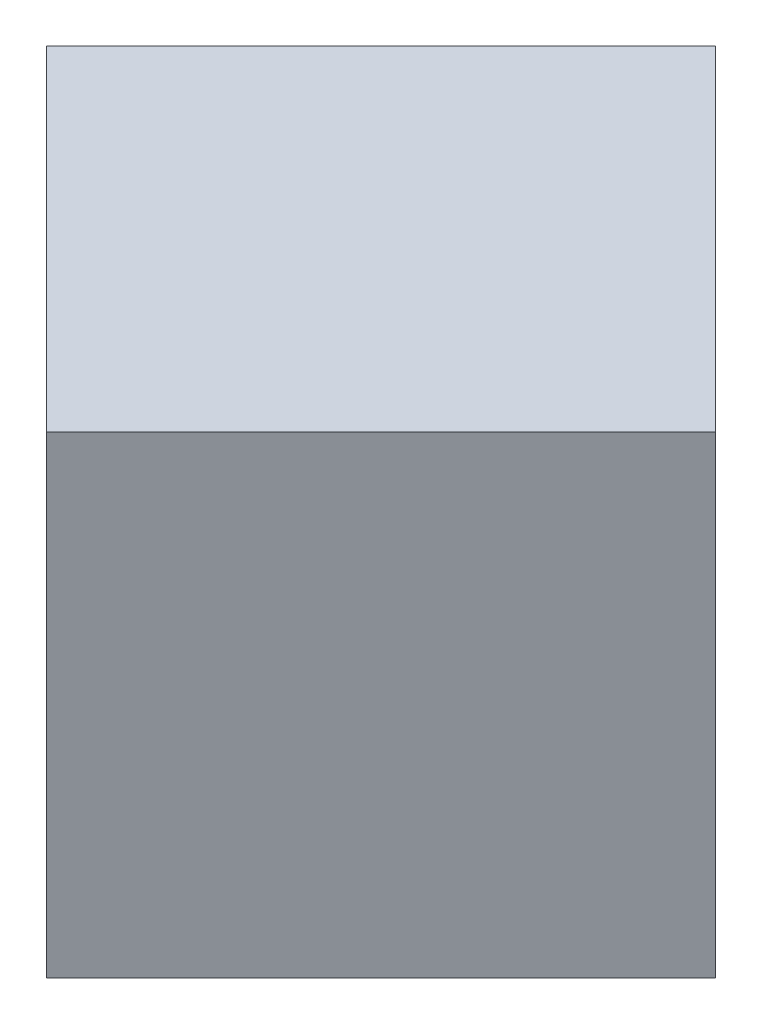
ISO-10303-21;
HEADER;
FILE_DESCRIPTION(('STEP AP214'),'2;1');
FILE_NAME('part.step','',(''),(''),'','','');
FILE_SCHEMA(('AUTOMOTIVE_DESIGN { 1 0 10303 214 1 1 1 1 }'));
ENDSEC;
DATA;
#1=APPLICATION_CONTEXT('core data for automotive mechanical design processes');
#2=APPLICATION_PROTOCOL_DEFINITION('international standard','automotive_design',2000,#1);
#3=PRODUCT_CONTEXT('',#1,'mechanical');
#4=PRODUCT('Part','Part','',(#3));
#5=PRODUCT_RELATED_PRODUCT_CATEGORY('part','',(#4));
#6=PRODUCT_DEFINITION_FORMATION('','',#4);
#7=PRODUCT_DEFINITION_CONTEXT('part definition',#1,'design');
#8=PRODUCT_DEFINITION('design','',#6,#7);
#9=PRODUCT_DEFINITION_SHAPE('','',#8);
#10=(LENGTH_UNIT() NAMED_UNIT(*) SI_UNIT(.MILLI.,.METRE.));
#11=(NAMED_UNIT(*) PLANE_ANGLE_UNIT() SI_UNIT($,.RADIAN.));
#12=(NAMED_UNIT(*) SI_UNIT($,.STERADIAN.) SOLID_ANGLE_UNIT());
#13=UNCERTAINTY_MEASURE_WITH_UNIT(LENGTH_MEASURE(1.E-05),#10,'distance_accuracy_value','');
#14=(GEOMETRIC_REPRESENTATION_CONTEXT(3) GLOBAL_UNCERTAINTY_ASSIGNED_CONTEXT((#13)) GLOBAL_UNIT_ASSIGNED_CONTEXT((#10,
#11,#12)) REPRESENTATION_CONTEXT('',''));
#15=CARTESIAN_POINT('',(0.,0.,0.));
#16=DIRECTION('',(0.,0.,1.));
#17=DIRECTION('',(1.,0.,0.));
#18=AXIS2_PLACEMENT_3D('',#15,#16,#17);
#19=CARTESIAN_POINT('',(22.9809703885631,65.,22.9809703885629));
#20=DIRECTION('',(-0.707106781186551,0.,-0.707106781186544));
#21=DIRECTION('',(-0.707106781186544,0.,0.707106781186551));
#22=AXIS2_PLACEMENT_3D('',#19,#20,#21);
#23=PLANE('',#22);
#24=DIRECTION('',(0.707106781186544,0.,-0.707106781186551));
#25=VECTOR('',#24,1.);
#26=CARTESIAN_POINT('',(22.9809703885631,0.,22.9809703885629));
#27=LINE('',#26,#25);
#28=CARTESIAN_POINT('',(3.85108611666851E-13,0.,45.9619407771259));
#29=VERTEX_POINT('',#28);
#30=CARTESIAN_POINT('',(45.9619407771259,0.,-1.35308431126191E-13));
#31=VERTEX_POINT('',#30);
#32=EDGE_CURVE('E97',#29,#31,#27,.T.);
#33=ORIENTED_EDGE('',*,*,#32,.T.);
#34=DIRECTION('',(0.,-1.,0.));
#35=VECTOR('',#34,1.);
#36=CARTESIAN_POINT('',(45.9619407771259,65.,-1.35308431126191E-13));
#37=LINE('',#36,#35);
#38=CARTESIAN_POINT('',(45.9619407771259,65.,-1.35308431126191E-13));
#39=VERTEX_POINT('',#38);
#40=EDGE_CURVE('E11',#39,#31,#37,.T.);
#41=ORIENTED_EDGE('',*,*,#40,.F.);
#42=DIRECTION('',(0.707106781186544,0.,-0.707106781186551));
#43=VECTOR('',#42,1.);
#44=CARTESIAN_POINT('',(22.9809703885631,65.,22.9809703885629));
#45=LINE('',#44,#43);
#46=CARTESIAN_POINT('',(3.85108611666851E-13,65.,45.9619407771259));
#47=VERTEX_POINT('',#46);
#48=EDGE_CURVE('E83',#47,#39,#45,.T.);
#49=ORIENTED_EDGE('',*,*,#48,.F.);
#50=DIRECTION('',(0.,-1.,0.));
#51=VECTOR('',#50,1.);
#52=CARTESIAN_POINT('',(3.85108611666851E-13,65.,45.9619407771259));
#53=LINE('',#52,#51);
#54=EDGE_CURVE('E50',#47,#29,#53,.T.);
#55=ORIENTED_EDGE('',*,*,#54,.T.);
#56=EDGE_LOOP('',(#33,#41,#49,#55));
#57=FACE_BOUND('',#56,.T.);
#58=ADVANCED_FACE('F34',(#57),#23,.F.);
#59=CARTESIAN_POINT('',(22.9809703885628,65.,-22.980970388563));
#60=DIRECTION('',(-0.707106781186544,0.,0.707106781186551));
#61=DIRECTION('',(0.707106781186551,0.,0.707106781186544));
#62=AXIS2_PLACEMENT_3D('',#59,#60,#61);
#63=PLANE('',#62);
#64=DIRECTION('',(-0.707106781186551,0.,-0.707106781186544));
#65=VECTOR('',#64,1.);
#66=CARTESIAN_POINT('',(22.9809703885628,0.,-22.980970388563));
#67=LINE('',#66,#65);
#68=CARTESIAN_POINT('',(0.,0.,-45.9619407771255));
#69=VERTEX_POINT('',#68);
#70=EDGE_CURVE('E88',#31,#69,#67,.T.);
#71=ORIENTED_EDGE('',*,*,#70,.T.);
#72=DIRECTION('',(0.,-1.,0.));
#73=VECTOR('',#72,1.);
#74=CARTESIAN_POINT('',(0.,65.,-45.9619407771255));
#75=LINE('',#74,#73);
#76=CARTESIAN_POINT('',(0.,65.,-45.9619407771255));
#77=VERTEX_POINT('',#76);
#78=EDGE_CURVE('E42',#77,#69,#75,.T.);
#79=ORIENTED_EDGE('',*,*,#78,.F.);
#80=DIRECTION('',(-0.707106781186551,0.,-0.707106781186544));
#81=VECTOR('',#80,1.);
#82=CARTESIAN_POINT('',(22.9809703885628,65.,-22.980970388563));
#83=LINE('',#82,#81);
#84=EDGE_CURVE('E75',#39,#77,#83,.T.);
#85=ORIENTED_EDGE('',*,*,#84,.F.);
#86=ORIENTED_EDGE('',*,*,#40,.T.);
#87=EDGE_LOOP('',(#71,#79,#85,#86));
#88=FACE_BOUND('',#87,.T.);
#89=ADVANCED_FACE('F87',(#88),#63,.F.);
#90=CARTESIAN_POINT('',(-22.9809703885627,65.,-22.9809703885626));
#91=DIRECTION('',(-0.707106781186549,0.,-0.707106781186546));
#92=DIRECTION('',(-0.707106781186546,0.,0.707106781186549));
#93=AXIS2_PLACEMENT_3D('',#90,#91,#92);
#94=PLANE('',#93);
#95=DIRECTION('',(0.707106781186546,0.,-0.707106781186549));
#96=VECTOR('',#95,1.);
#97=CARTESIAN_POINT('',(-22.9809703885627,0.,-22.9809703885626));
#98=LINE('',#97,#96);
#99=CARTESIAN_POINT('',(-45.9619407771255,0.,2.22044604925031E-13));
#100=VERTEX_POINT('',#99);
#101=EDGE_CURVE('E100',#100,#69,#98,.T.);
#102=ORIENTED_EDGE('',*,*,#101,.F.);
#103=DIRECTION('',(0.,-1.,0.));
#104=VECTOR('',#103,1.);
#105=CARTESIAN_POINT('',(-45.9619407771255,65.,2.22044604925031E-13));
#106=LINE('',#105,#104);
#107=CARTESIAN_POINT('',(-45.9619407771255,65.,2.22044604925031E-13));
#108=VERTEX_POINT('',#107);
#109=EDGE_CURVE('E64',#108,#100,#106,.T.);
#110=ORIENTED_EDGE('',*,*,#109,.F.);
#111=DIRECTION('',(0.707106781186546,0.,-0.707106781186549));
#112=VECTOR('',#111,1.);
#113=CARTESIAN_POINT('',(-22.9809703885627,65.,-22.9809703885626));
#114=LINE('',#113,#112);
#115=EDGE_CURVE('E82',#108,#77,#114,.T.);
#116=ORIENTED_EDGE('',*,*,#115,.T.);
#117=ORIENTED_EDGE('',*,*,#78,.T.);
#118=EDGE_LOOP('',(#102,#110,#116,#117));
#119=FACE_BOUND('',#118,.T.);
#120=ADVANCED_FACE('F91',(#119),#94,.T.);
#121=CARTESIAN_POINT('',(-22.9809703885627,65.,22.9809703885628));
#122=DIRECTION('',(-0.707106781186546,0.,0.707106781186549));
#123=DIRECTION('',(0.707106781186549,0.,0.707106781186546));
#124=AXIS2_PLACEMENT_3D('',#121,#122,#123);
#125=PLANE('',#124);
#126=DIRECTION('',(-0.707106781186549,0.,-0.707106781186546));
#127=VECTOR('',#126,1.);
#128=CARTESIAN_POINT('',(-22.9809703885627,0.,22.9809703885628));
#129=LINE('',#128,#127);
#130=EDGE_CURVE('E102',#29,#100,#129,.T.);
#131=ORIENTED_EDGE('',*,*,#130,.F.);
#132=ORIENTED_EDGE('',*,*,#54,.F.);
#133=DIRECTION('',(-0.707106781186549,0.,-0.707106781186546));
#134=VECTOR('',#133,1.);
#135=CARTESIAN_POINT('',(-22.9809703885627,65.,22.9809703885628));
#136=LINE('',#135,#134);
#137=EDGE_CURVE('E92',#47,#108,#136,.T.);
#138=ORIENTED_EDGE('',*,*,#137,.T.);
#139=ORIENTED_EDGE('',*,*,#109,.T.);
#140=EDGE_LOOP('',(#131,#132,#138,#139));
#141=FACE_BOUND('',#140,.T.);
#142=ADVANCED_FACE('F108',(#141),#125,.T.);
#143=CARTESIAN_POINT('',(0.,65.,0.));
#144=DIRECTION('',(0.,1.,0.));
#145=DIRECTION('',(0.,0.,1.));
#146=AXIS2_PLACEMENT_3D('',#143,#144,#145);
#147=PLANE('',#146);
#148=ORIENTED_EDGE('',*,*,#48,.T.);
#149=ORIENTED_EDGE('',*,*,#84,.T.);
#150=ORIENTED_EDGE('',*,*,#115,.F.);
#151=ORIENTED_EDGE('',*,*,#137,.F.);
#152=EDGE_LOOP('',(#148,#149,#150,#151));
#153=FACE_BOUND('',#152,.T.);
#154=ADVANCED_FACE('F79',(#153),#147,.T.);
#155=CARTESIAN_POINT('',(0.,0.,0.));
#156=DIRECTION('',(0.,1.,0.));
#157=DIRECTION('',(0.,0.,1.));
#158=AXIS2_PLACEMENT_3D('',#155,#156,#157);
#159=PLANE('',#158);
#160=ORIENTED_EDGE('',*,*,#32,.F.);
#161=ORIENTED_EDGE('',*,*,#130,.T.);
#162=ORIENTED_EDGE('',*,*,#101,.T.);
#163=ORIENTED_EDGE('',*,*,#70,.F.);
#164=EDGE_LOOP('',(#160,#161,#162,#163));
#165=FACE_BOUND('',#164,.T.);
#166=ADVANCED_FACE('F107',(#165),#159,.F.);
#167=CLOSED_SHELL('',(#58,#89,#120,#142,#154,#166));
#168=MANIFOLD_SOLID_BREP('B2',#167);
#169=ADVANCED_BREP_SHAPE_REPRESENTATION('',(#18,#168),#14);
#170=SHAPE_DEFINITION_REPRESENTATION(#9,#169);
ENDSEC;
END-ISO-10303-21;
